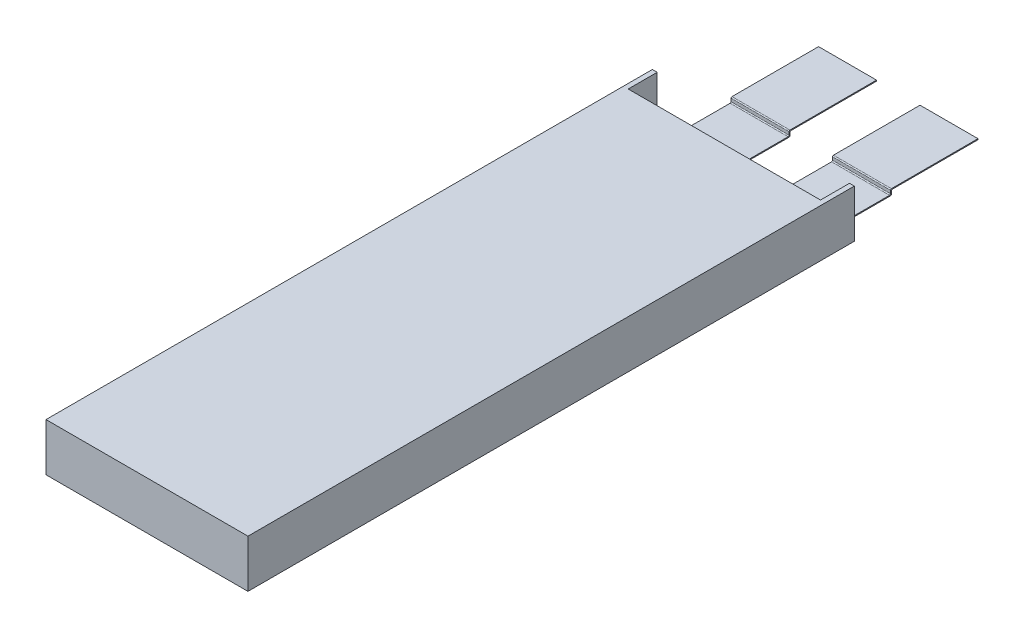
ISO-10303-21;
HEADER;
FILE_DESCRIPTION(('STEP AP214'),'2;1');
FILE_NAME('part.step','',(''),(''),'','','');
FILE_SCHEMA(('AUTOMOTIVE_DESIGN { 1 0 10303 214 1 1 1 1 }'));
ENDSEC;
DATA;
#1=APPLICATION_CONTEXT('core data for automotive mechanical design processes');
#2=APPLICATION_PROTOCOL_DEFINITION('international standard','automotive_design',2000,#1);
#3=PRODUCT_CONTEXT('',#1,'mechanical');
#4=PRODUCT('Part','Part','',(#3));
#5=PRODUCT_RELATED_PRODUCT_CATEGORY('part','',(#4));
#6=PRODUCT_DEFINITION_FORMATION('','',#4);
#7=PRODUCT_DEFINITION_CONTEXT('part definition',#1,'design');
#8=PRODUCT_DEFINITION('design','',#6,#7);
#9=PRODUCT_DEFINITION_SHAPE('','',#8);
#10=(LENGTH_UNIT() NAMED_UNIT(*) SI_UNIT(.MILLI.,.METRE.));
#11=(NAMED_UNIT(*) PLANE_ANGLE_UNIT() SI_UNIT($,.RADIAN.));
#12=(NAMED_UNIT(*) SI_UNIT($,.STERADIAN.) SOLID_ANGLE_UNIT());
#13=UNCERTAINTY_MEASURE_WITH_UNIT(LENGTH_MEASURE(1.E-05),#10,'distance_accuracy_value','');
#14=(GEOMETRIC_REPRESENTATION_CONTEXT(3) GLOBAL_UNCERTAINTY_ASSIGNED_CONTEXT((#13)) GLOBAL_UNIT_ASSIGNED_CONTEXT((#10,
#11,#12)) REPRESENTATION_CONTEXT('',''));
#15=CARTESIAN_POINT('',(0.,0.,0.));
#16=DIRECTION('',(0.,0.,1.));
#17=DIRECTION('',(1.,0.,0.));
#18=AXIS2_PLACEMENT_3D('',#15,#16,#17);
#19=CARTESIAN_POINT('',(0.,1.,0.));
#20=DIRECTION('',(0.,-1.,0.));
#21=DIRECTION('',(0.,0.,-1.));
#22=AXIS2_PLACEMENT_3D('',#19,#20,#21);
#23=PLANE('',#22);
#24=DIRECTION('',(-1.,0.,0.));
#25=VECTOR('',#24,1.);
#26=CARTESIAN_POINT('',(20.9,1.,-56.75));
#27=LINE('',#26,#25);
#28=CARTESIAN_POINT('',(19.9,1.,-56.75));
#29=VERTEX_POINT('',#28);
#30=CARTESIAN_POINT('',(-19.9,1.,-56.75));
#31=VERTEX_POINT('',#30);
#32=EDGE_CURVE('E542',#29,#31,#27,.T.);
#33=ORIENTED_EDGE('',*,*,#32,.F.);
#34=DIRECTION('',(0.,0.,-1.));
#35=VECTOR('',#34,1.);
#36=CARTESIAN_POINT('',(19.9,1.,-62.75));
#37=LINE('',#36,#35);
#38=CARTESIAN_POINT('',(19.9,1.,-62.75));
#39=VERTEX_POINT('',#38);
#40=EDGE_CURVE('E260',#29,#39,#37,.T.);
#41=ORIENTED_EDGE('',*,*,#40,.T.);
#42=DIRECTION('',(-1.,0.,0.));
#43=VECTOR('',#42,1.);
#44=CARTESIAN_POINT('',(20.9,1.,-62.75));
#45=LINE('',#44,#43);
#46=CARTESIAN_POINT('',(-19.9,1.,-62.75));
#47=VERTEX_POINT('',#46);
#48=EDGE_CURVE('E561',#39,#47,#45,.T.);
#49=ORIENTED_EDGE('',*,*,#48,.T.);
#50=DIRECTION('',(0.,0.,-1.));
#51=VECTOR('',#50,1.);
#52=CARTESIAN_POINT('',(-19.9,1.,-62.75));
#53=LINE('',#52,#51);
#54=EDGE_CURVE('E523',#31,#47,#53,.T.);
#55=ORIENTED_EDGE('',*,*,#54,.F.);
#56=EDGE_LOOP('',(#33,#41,#49,#55));
#57=FACE_BOUND('',#56,.T.);
#58=ADVANCED_FACE('F39',(#57),#23,.F.);
#59=CARTESIAN_POINT('',(20.9,9.9,-56.75));
#60=DIRECTION('',(0.,0.,1.));
#61=DIRECTION('',(1.,0.,0.));
#62=AXIS2_PLACEMENT_3D('',#59,#60,#61);
#63=PLANE('',#62);
#64=DIRECTION('',(-1.,0.,0.));
#65=VECTOR('',#64,1.);
#66=CARTESIAN_POINT('',(20.9,9.9,-56.75));
#67=LINE('',#66,#65);
#68=CARTESIAN_POINT('',(19.9,9.9,-56.75));
#69=VERTEX_POINT('',#68);
#70=CARTESIAN_POINT('',(-19.9,9.9,-56.75));
#71=VERTEX_POINT('',#70);
#72=EDGE_CURVE('E555',#69,#71,#67,.T.);
#73=ORIENTED_EDGE('',*,*,#72,.F.);
#74=DIRECTION('',(0.,-1.,0.));
#75=VECTOR('',#74,1.);
#76=CARTESIAN_POINT('',(19.9,9.9,-56.75));
#77=LINE('',#76,#75);
#78=EDGE_CURVE('E393',#69,#29,#77,.T.);
#79=ORIENTED_EDGE('',*,*,#78,.T.);
#80=ORIENTED_EDGE('',*,*,#32,.T.);
#81=DIRECTION('',(0.,-1.,0.));
#82=VECTOR('',#81,1.);
#83=CARTESIAN_POINT('',(-19.9,9.9,-56.75));
#84=LINE('',#83,#82);
#85=EDGE_CURVE('E538',#71,#31,#84,.T.);
#86=ORIENTED_EDGE('',*,*,#85,.F.);
#87=EDGE_LOOP('',(#73,#79,#80,#86));
#88=FACE_BOUND('',#87,.T.);
#89=ADVANCED_FACE('F652',(#88),#63,.F.);
#90=CARTESIAN_POINT('',(-20.9,1.,-62.75));
#91=DIRECTION('',(1.,0.,0.));
#92=DIRECTION('',(0.,0.,-1.));
#93=AXIS2_PLACEMENT_3D('',#90,#91,#92);
#94=PLANE('',#93);
#95=DIRECTION('',(0.,0.,1.));
#96=VECTOR('',#95,1.);
#97=CARTESIAN_POINT('',(-20.9,0.,-62.75));
#98=LINE('',#97,#96);
#99=CARTESIAN_POINT('',(-20.9,0.,-62.75));
#100=VERTEX_POINT('',#99);
#101=CARTESIAN_POINT('',(-20.9,0.,62.75));
#102=VERTEX_POINT('',#101);
#103=EDGE_CURVE('E558',#100,#102,#98,.T.);
#104=ORIENTED_EDGE('',*,*,#103,.T.);
#105=DIRECTION('',(0.,-1.,0.));
#106=VECTOR('',#105,1.);
#107=CARTESIAN_POINT('',(-20.9,1.,62.75));
#108=LINE('',#107,#106);
#109=CARTESIAN_POINT('',(-20.9,9.9,62.75));
#110=VERTEX_POINT('',#109);
#111=EDGE_CURVE('E11',#110,#102,#108,.T.);
#112=ORIENTED_EDGE('',*,*,#111,.F.);
#113=DIRECTION('',(0.,0.,1.));
#114=VECTOR('',#113,1.);
#115=CARTESIAN_POINT('',(-20.9,9.9,-56.75));
#116=LINE('',#115,#114);
#117=CARTESIAN_POINT('',(-20.9,9.9,-62.75));
#118=VERTEX_POINT('',#117);
#119=EDGE_CURVE('E543',#118,#110,#116,.T.);
#120=ORIENTED_EDGE('',*,*,#119,.F.);
#121=DIRECTION('',(0.,-1.,0.));
#122=VECTOR('',#121,1.);
#123=CARTESIAN_POINT('',(-20.9,1.,-62.75));
#124=LINE('',#123,#122);
#125=EDGE_CURVE('E564',#118,#100,#124,.T.);
#126=ORIENTED_EDGE('',*,*,#125,.T.);
#127=EDGE_LOOP('',(#104,#112,#120,#126));
#128=FACE_BOUND('',#127,.T.);
#129=ADVANCED_FACE('F41',(#128),#94,.F.);
#130=CARTESIAN_POINT('',(20.9,1.,62.75));
#131=DIRECTION('',(0.,0.,-1.));
#132=DIRECTION('',(-1.,0.,0.));
#133=AXIS2_PLACEMENT_3D('',#130,#131,#132);
#134=PLANE('',#133);
#135=DIRECTION('',(1.,0.,0.));
#136=VECTOR('',#135,1.);
#137=CARTESIAN_POINT('',(20.9,0.,62.75));
#138=LINE('',#137,#136);
#139=CARTESIAN_POINT('',(20.9,0.,62.75));
#140=VERTEX_POINT('',#139);
#141=EDGE_CURVE('E569',#102,#140,#138,.T.);
#142=ORIENTED_EDGE('',*,*,#141,.T.);
#143=DIRECTION('',(0.,-1.,0.));
#144=VECTOR('',#143,1.);
#145=CARTESIAN_POINT('',(20.9,1.,62.75));
#146=LINE('',#145,#144);
#147=CARTESIAN_POINT('',(20.9,9.9,62.75));
#148=VERTEX_POINT('',#147);
#149=EDGE_CURVE('E48',#148,#140,#146,.T.);
#150=ORIENTED_EDGE('',*,*,#149,.F.);
#151=DIRECTION('',(1.,0.,0.));
#152=VECTOR('',#151,1.);
#153=CARTESIAN_POINT('',(20.9,9.9,62.75));
#154=LINE('',#153,#152);
#155=EDGE_CURVE('E547',#110,#148,#154,.T.);
#156=ORIENTED_EDGE('',*,*,#155,.F.);
#157=ORIENTED_EDGE('',*,*,#111,.T.);
#158=EDGE_LOOP('',(#142,#150,#156,#157));
#159=FACE_BOUND('',#158,.T.);
#160=ADVANCED_FACE('F606',(#159),#134,.F.);
#161=CARTESIAN_POINT('',(20.9,1.,-62.75));
#162=DIRECTION('',(-1.,0.,0.));
#163=DIRECTION('',(0.,0.,1.));
#164=AXIS2_PLACEMENT_3D('',#161,#162,#163);
#165=PLANE('',#164);
#166=DIRECTION('',(0.,0.,-1.));
#167=VECTOR('',#166,1.);
#168=CARTESIAN_POINT('',(20.9,0.,-62.75));
#169=LINE('',#168,#167);
#170=CARTESIAN_POINT('',(20.9,0.,-62.75));
#171=VERTEX_POINT('',#170);
#172=EDGE_CURVE('E572',#140,#171,#169,.T.);
#173=ORIENTED_EDGE('',*,*,#172,.T.);
#174=DIRECTION('',(0.,-1.,0.));
#175=VECTOR('',#174,1.);
#176=CARTESIAN_POINT('',(20.9,1.,-62.75));
#177=LINE('',#176,#175);
#178=CARTESIAN_POINT('',(20.9,9.9,-62.75));
#179=VERTEX_POINT('',#178);
#180=EDGE_CURVE('E583',#179,#171,#177,.T.);
#181=ORIENTED_EDGE('',*,*,#180,.F.);
#182=DIRECTION('',(0.,0.,-1.));
#183=VECTOR('',#182,1.);
#184=CARTESIAN_POINT('',(20.9,9.9,-56.75));
#185=LINE('',#184,#183);
#186=EDGE_CURVE('E551',#148,#179,#185,.T.);
#187=ORIENTED_EDGE('',*,*,#186,.F.);
#188=ORIENTED_EDGE('',*,*,#149,.T.);
#189=EDGE_LOOP('',(#173,#181,#187,#188));
#190=FACE_BOUND('',#189,.T.);
#191=ADVANCED_FACE('F591',(#190),#165,.F.);
#192=CARTESIAN_POINT('',(20.9,1.,-62.75));
#193=DIRECTION('',(0.,0.,1.));
#194=DIRECTION('',(1.,0.,0.));
#195=AXIS2_PLACEMENT_3D('',#192,#193,#194);
#196=PLANE('',#195);
#197=DIRECTION('',(1.,0.,0.));
#198=VECTOR('',#197,1.);
#199=CARTESIAN_POINT('',(-16.5,0.2,-62.75));
#200=LINE('',#199,#198);
#201=CARTESIAN_POINT('',(-16.5,0.2,-62.75));
#202=VERTEX_POINT('',#201);
#203=CARTESIAN_POINT('',(-4.5,0.199999999999999,-62.75));
#204=VERTEX_POINT('',#203);
#205=EDGE_CURVE('E55',#202,#204,#200,.T.);
#206=ORIENTED_EDGE('',*,*,#205,.F.);
#207=DIRECTION('',(0.,-1.,0.));
#208=VECTOR('',#207,1.);
#209=CARTESIAN_POINT('',(-16.5,0.,-62.75));
#210=LINE('',#209,#208);
#211=CARTESIAN_POINT('',(-16.5,0.,-62.75));
#212=VERTEX_POINT('',#211);
#213=EDGE_CURVE('E294',#202,#212,#210,.T.);
#214=ORIENTED_EDGE('',*,*,#213,.T.);
#215=DIRECTION('',(-1.,0.,0.));
#216=VECTOR('',#215,1.);
#217=CARTESIAN_POINT('',(20.9,0.,-62.75));
#218=LINE('',#217,#216);
#219=EDGE_CURVE('E575',#212,#100,#218,.T.);
#220=ORIENTED_EDGE('',*,*,#219,.T.);
#221=ORIENTED_EDGE('',*,*,#125,.F.);
#222=DIRECTION('',(-1.,0.,0.));
#223=VECTOR('',#222,1.);
#224=CARTESIAN_POINT('',(-20.9,9.9,-62.75));
#225=LINE('',#224,#223);
#226=CARTESIAN_POINT('',(-19.9,9.9,-62.75));
#227=VERTEX_POINT('',#226);
#228=EDGE_CURVE('E527',#227,#118,#225,.T.);
#229=ORIENTED_EDGE('',*,*,#228,.F.);
#230=DIRECTION('',(0.,-1.,0.));
#231=VECTOR('',#230,1.);
#232=CARTESIAN_POINT('',(-19.9,9.9,-62.75));
#233=LINE('',#232,#231);
#234=EDGE_CURVE('E531',#227,#47,#233,.T.);
#235=ORIENTED_EDGE('',*,*,#234,.T.);
#236=ORIENTED_EDGE('',*,*,#48,.F.);
#237=DIRECTION('',(0.,-1.,0.));
#238=VECTOR('',#237,1.);
#239=CARTESIAN_POINT('',(19.9,9.9,-62.75));
#240=LINE('',#239,#238);
#241=CARTESIAN_POINT('',(19.9,9.9,-62.75));
#242=VERTEX_POINT('',#241);
#243=EDGE_CURVE('E400',#242,#39,#240,.T.);
#244=ORIENTED_EDGE('',*,*,#243,.F.);
#245=DIRECTION('',(1.,0.,0.));
#246=VECTOR('',#245,1.);
#247=CARTESIAN_POINT('',(20.9,9.9,-62.75));
#248=LINE('',#247,#246);
#249=EDGE_CURVE('E385',#242,#179,#248,.T.);
#250=ORIENTED_EDGE('',*,*,#249,.T.);
#251=ORIENTED_EDGE('',*,*,#180,.T.);
#252=CARTESIAN_POINT('',(16.5,0.,-62.75));
#253=VERTEX_POINT('',#252);
#254=EDGE_CURVE('E565',#171,#253,#218,.T.);
#255=ORIENTED_EDGE('',*,*,#254,.T.);
#256=DIRECTION('',(0.,-1.,0.));
#257=VECTOR('',#256,1.);
#258=CARTESIAN_POINT('',(16.5,0.,-62.75));
#259=LINE('',#258,#257);
#260=CARTESIAN_POINT('',(16.5,0.2,-62.75));
#261=VERTEX_POINT('',#260);
#262=EDGE_CURVE('E424',#261,#253,#259,.T.);
#263=ORIENTED_EDGE('',*,*,#262,.F.);
#264=DIRECTION('',(-1.,0.,0.));
#265=VECTOR('',#264,1.);
#266=CARTESIAN_POINT('',(16.5,0.2,-62.75));
#267=LINE('',#266,#265);
#268=CARTESIAN_POINT('',(4.5,0.2,-62.75));
#269=VERTEX_POINT('',#268);
#270=EDGE_CURVE('E499',#261,#269,#267,.T.);
#271=ORIENTED_EDGE('',*,*,#270,.T.);
#272=DIRECTION('',(0.,-1.,0.));
#273=VECTOR('',#272,1.);
#274=CARTESIAN_POINT('',(4.5,0.,-62.75));
#275=LINE('',#274,#273);
#276=CARTESIAN_POINT('',(4.5,0.,-62.75));
#277=VERTEX_POINT('',#276);
#278=EDGE_CURVE('E462',#269,#277,#275,.T.);
#279=ORIENTED_EDGE('',*,*,#278,.T.);
#280=CARTESIAN_POINT('',(-4.5,0.,-62.75));
#281=VERTEX_POINT('',#280);
#282=EDGE_CURVE('E579',#277,#281,#218,.T.);
#283=ORIENTED_EDGE('',*,*,#282,.T.);
#284=DIRECTION('',(0.,-1.,0.));
#285=VECTOR('',#284,1.);
#286=CARTESIAN_POINT('',(-4.5,0.,-62.75));
#287=LINE('',#286,#285);
#288=EDGE_CURVE('E60',#204,#281,#287,.T.);
#289=ORIENTED_EDGE('',*,*,#288,.F.);
#290=EDGE_LOOP('',(#206,#214,#220,#221,#229,#235,#236,#244,#250,#251,#255,#263,#271,#279,#283,#289));
#291=FACE_BOUND('',#290,.T.);
#292=ADVANCED_FACE('F601',(#291),#196,.F.);
#293=CARTESIAN_POINT('',(0.,0.,0.));
#294=DIRECTION('',(0.,-1.,0.));
#295=DIRECTION('',(0.,0.,-1.));
#296=AXIS2_PLACEMENT_3D('',#293,#294,#295);
#297=PLANE('',#296);
#298=ORIENTED_EDGE('',*,*,#103,.F.);
#299=ORIENTED_EDGE('',*,*,#219,.F.);
#300=DIRECTION('',(0.,0.,-1.));
#301=VECTOR('',#300,1.);
#302=CARTESIAN_POINT('',(-16.5,0.,-62.75));
#303=LINE('',#302,#301);
#304=CARTESIAN_POINT('',(-16.5,0.,-74.6375719936611));
#305=VERTEX_POINT('',#304);
#306=EDGE_CURVE('E290',#212,#305,#303,.T.);
#307=ORIENTED_EDGE('',*,*,#306,.T.);
#308=DIRECTION('',(1.,0.,0.));
#309=VECTOR('',#308,1.);
#310=CARTESIAN_POINT('',(-16.5,0.,-74.6375719936611));
#311=LINE('',#310,#309);
#312=CARTESIAN_POINT('',(-4.5,0.,-74.6375719936611));
#313=VERTEX_POINT('',#312);
#314=EDGE_CURVE('E374',#305,#313,#311,.T.);
#315=ORIENTED_EDGE('',*,*,#314,.T.);
#316=DIRECTION('',(0.,0.,-1.));
#317=VECTOR('',#316,1.);
#318=CARTESIAN_POINT('',(-4.5,0.,-62.75));
#319=LINE('',#318,#317);
#320=EDGE_CURVE('E333',#281,#313,#319,.T.);
#321=ORIENTED_EDGE('',*,*,#320,.F.);
#322=ORIENTED_EDGE('',*,*,#282,.F.);
#323=DIRECTION('',(0.,0.,-1.));
#324=VECTOR('',#323,1.);
#325=CARTESIAN_POINT('',(4.5,0.,-62.75));
#326=LINE('',#325,#324);
#327=CARTESIAN_POINT('',(4.5,0.,-74.6375719936611));
#328=VERTEX_POINT('',#327);
#329=EDGE_CURVE('E466',#277,#328,#326,.T.);
#330=ORIENTED_EDGE('',*,*,#329,.T.);
#331=DIRECTION('',(-1.,0.,0.));
#332=VECTOR('',#331,1.);
#333=CARTESIAN_POINT('',(16.5,0.,-74.6375719936611));
#334=LINE('',#333,#332);
#335=CARTESIAN_POINT('',(16.5,0.,-74.6375719936611));
#336=VERTEX_POINT('',#335);
#337=EDGE_CURVE('E495',#336,#328,#334,.T.);
#338=ORIENTED_EDGE('',*,*,#337,.F.);
#339=DIRECTION('',(0.,0.,-1.));
#340=VECTOR('',#339,1.);
#341=CARTESIAN_POINT('',(16.5,0.,-62.75));
#342=LINE('',#341,#340);
#343=EDGE_CURVE('E427',#253,#336,#342,.T.);
#344=ORIENTED_EDGE('',*,*,#343,.F.);
#345=ORIENTED_EDGE('',*,*,#254,.F.);
#346=ORIENTED_EDGE('',*,*,#172,.F.);
#347=ORIENTED_EDGE('',*,*,#141,.F.);
#348=EDGE_LOOP('',(#298,#299,#307,#315,#321,#322,#330,#338,#344,#345,#346,#347));
#349=FACE_BOUND('',#348,.T.);
#350=ADVANCED_FACE('F597',(#349),#297,.T.);
#351=CARTESIAN_POINT('',(0.,9.9,0.));
#352=DIRECTION('',(0.,-1.,0.));
#353=DIRECTION('',(0.,0.,-1.));
#354=AXIS2_PLACEMENT_3D('',#351,#352,#353);
#355=PLANE('',#354);
#356=ORIENTED_EDGE('',*,*,#119,.T.);
#357=ORIENTED_EDGE('',*,*,#155,.T.);
#358=ORIENTED_EDGE('',*,*,#186,.T.);
#359=ORIENTED_EDGE('',*,*,#249,.F.);
#360=DIRECTION('',(0.,0.,-1.));
#361=VECTOR('',#360,1.);
#362=CARTESIAN_POINT('',(19.9,9.9,-62.75));
#363=LINE('',#362,#361);
#364=EDGE_CURVE('E389',#69,#242,#363,.T.);
#365=ORIENTED_EDGE('',*,*,#364,.F.);
#366=ORIENTED_EDGE('',*,*,#72,.T.);
#367=DIRECTION('',(0.,0.,-1.));
#368=VECTOR('',#367,1.);
#369=CARTESIAN_POINT('',(-19.9,9.9,-62.75));
#370=LINE('',#369,#368);
#371=EDGE_CURVE('E524',#71,#227,#370,.T.);
#372=ORIENTED_EDGE('',*,*,#371,.T.);
#373=ORIENTED_EDGE('',*,*,#228,.T.);
#374=EDGE_LOOP('',(#356,#357,#358,#359,#365,#366,#372,#373));
#375=FACE_BOUND('',#374,.T.);
#376=ADVANCED_FACE('F604',(#375),#355,.F.);
#377=CARTESIAN_POINT('',(-19.9,9.9,-62.75));
#378=DIRECTION('',(-1.,0.,0.));
#379=DIRECTION('',(0.,0.,1.));
#380=AXIS2_PLACEMENT_3D('',#377,#378,#379);
#381=PLANE('',#380);
#382=ORIENTED_EDGE('',*,*,#54,.T.);
#383=ORIENTED_EDGE('',*,*,#234,.F.);
#384=ORIENTED_EDGE('',*,*,#371,.F.);
#385=ORIENTED_EDGE('',*,*,#85,.T.);
#386=EDGE_LOOP('',(#382,#383,#384,#385));
#387=FACE_BOUND('',#386,.T.);
#388=ADVANCED_FACE('F716',(#387),#381,.F.);
#389=CARTESIAN_POINT('',(16.5,1.2,-92.75));
#390=DIRECTION('',(0.,0.,1.));
#391=DIRECTION('',(1.,0.,0.));
#392=AXIS2_PLACEMENT_3D('',#389,#390,#391);
#393=PLANE('',#392);
#394=DIRECTION('',(0.,1.,0.));
#395=VECTOR('',#394,1.);
#396=CARTESIAN_POINT('',(4.5,1.2,-92.75));
#397=LINE('',#396,#395);
#398=CARTESIAN_POINT('',(4.5,1.,-92.75));
#399=VERTEX_POINT('',#398);
#400=CARTESIAN_POINT('',(4.5,1.2,-92.75));
#401=VERTEX_POINT('',#400);
#402=EDGE_CURVE('E403',#399,#401,#397,.T.);
#403=ORIENTED_EDGE('',*,*,#402,.T.);
#404=DIRECTION('',(-1.,0.,0.));
#405=VECTOR('',#404,1.);
#406=CARTESIAN_POINT('',(16.5,1.2,-92.75));
#407=LINE('',#406,#405);
#408=CARTESIAN_POINT('',(16.5,1.2,-92.75));
#409=VERTEX_POINT('',#408);
#410=EDGE_CURVE('E519',#409,#401,#407,.T.);
#411=ORIENTED_EDGE('',*,*,#410,.F.);
#412=DIRECTION('',(0.,1.,0.));
#413=VECTOR('',#412,1.);
#414=CARTESIAN_POINT('',(16.5,1.2,-92.75));
#415=LINE('',#414,#413);
#416=CARTESIAN_POINT('',(16.5,1.,-92.75));
#417=VERTEX_POINT('',#416);
#418=EDGE_CURVE('E404',#417,#409,#415,.T.);
#419=ORIENTED_EDGE('',*,*,#418,.F.);
#420=DIRECTION('',(-1.,0.,0.));
#421=VECTOR('',#420,1.);
#422=CARTESIAN_POINT('',(16.5,1.,-92.75));
#423=LINE('',#422,#421);
#424=EDGE_CURVE('E442',#417,#399,#423,.T.);
#425=ORIENTED_EDGE('',*,*,#424,.T.);
#426=EDGE_LOOP('',(#403,#411,#419,#425));
#427=FACE_BOUND('',#426,.T.);
#428=ADVANCED_FACE('F861',(#427),#393,.F.);
#429=CARTESIAN_POINT('',(16.5,1.2,-74.8375719936611));
#430=DIRECTION('',(0.,-1.,0.));
#431=DIRECTION('',(0.,0.,-1.));
#432=AXIS2_PLACEMENT_3D('',#429,#430,#431);
#433=PLANE('',#432);
#434=DIRECTION('',(0.,0.,1.));
#435=VECTOR('',#434,1.);
#436=CARTESIAN_POINT('',(4.5,1.2,-74.8375719936611));
#437=LINE('',#436,#435);
#438=CARTESIAN_POINT('',(4.5,1.2,-74.8375719936611));
#439=VERTEX_POINT('',#438);
#440=EDGE_CURVE('E446',#401,#439,#437,.T.);
#441=ORIENTED_EDGE('',*,*,#440,.T.);
#442=DIRECTION('',(-1.,0.,0.));
#443=VECTOR('',#442,1.);
#444=CARTESIAN_POINT('',(16.5,1.2,-74.8375719936611));
#445=LINE('',#444,#443);
#446=CARTESIAN_POINT('',(16.5,1.2,-74.8375719936611));
#447=VERTEX_POINT('',#446);
#448=EDGE_CURVE('E515',#447,#439,#445,.T.);
#449=ORIENTED_EDGE('',*,*,#448,.F.);
#450=DIRECTION('',(0.,0.,1.));
#451=VECTOR('',#450,1.);
#452=CARTESIAN_POINT('',(16.5,1.2,-74.8375719936611));
#453=LINE('',#452,#451);
#454=EDGE_CURVE('E408',#409,#447,#453,.T.);
#455=ORIENTED_EDGE('',*,*,#454,.F.);
#456=ORIENTED_EDGE('',*,*,#410,.T.);
#457=EDGE_LOOP('',(#441,#449,#455,#456));
#458=FACE_BOUND('',#457,.T.);
#459=ADVANCED_FACE('F857',(#458),#433,.F.);
#460=CARTESIAN_POINT('',(16.5,1.,-74.8375719936611));
#461=DIRECTION('',(-1.,0.,0.));
#462=DIRECTION('',(0.,0.,1.));
#463=AXIS2_PLACEMENT_3D('',#460,#461,#462);
#464=CYLINDRICAL_SURFACE('',#463,0.200000000000003);
#465=CARTESIAN_POINT('',(4.5,1.,-74.8375719936611));
#466=DIRECTION('',(1.,0.,0.));
#467=DIRECTION('',(0.,0.,-1.));
#468=AXIS2_PLACEMENT_3D('',#465,#466,#467);
#469=CIRCLE('',#468,0.200000000000003);
#470=CARTESIAN_POINT('',(4.5,0.999999999999999,-74.6375719936611));
#471=VERTEX_POINT('',#470);
#472=EDGE_CURVE('E449',#439,#471,#469,.T.);
#473=ORIENTED_EDGE('',*,*,#472,.T.);
#474=DIRECTION('',(-1.,0.,0.));
#475=VECTOR('',#474,1.);
#476=CARTESIAN_POINT('',(16.5,0.999999999999999,-74.6375719936611));
#477=LINE('',#476,#475);
#478=CARTESIAN_POINT('',(16.5,0.999999999999999,-74.6375719936611));
#479=VERTEX_POINT('',#478);
#480=EDGE_CURVE('E511',#479,#471,#477,.T.);
#481=ORIENTED_EDGE('',*,*,#480,.F.);
#482=CARTESIAN_POINT('',(16.5,1.,-74.8375719936611));
#483=DIRECTION('',(1.,0.,0.));
#484=DIRECTION('',(0.,0.,-1.));
#485=AXIS2_PLACEMENT_3D('',#482,#483,#484);
#486=CIRCLE('',#485,0.200000000000003);
#487=EDGE_CURVE('E412',#447,#479,#486,.T.);
#488=ORIENTED_EDGE('',*,*,#487,.F.);
#489=ORIENTED_EDGE('',*,*,#448,.T.);
#490=EDGE_LOOP('',(#473,#481,#488,#489));
#491=FACE_BOUND('',#490,.T.);
#492=ADVANCED_FACE('F853',(#491),#464,.T.);
#493=CARTESIAN_POINT('',(16.5,0.999999999999999,-74.6375719936611));
#494=DIRECTION('',(0.,0.,-1.));
#495=DIRECTION('',(-1.,0.,0.));
#496=AXIS2_PLACEMENT_3D('',#493,#494,#495);
#497=PLANE('',#496);
#498=DIRECTION('',(0.,-1.,0.));
#499=VECTOR('',#498,1.);
#500=CARTESIAN_POINT('',(4.5,0.999999999999999,-74.6375719936611));
#501=LINE('',#500,#499);
#502=CARTESIAN_POINT('',(4.5,0.400000000000001,-74.6375719936611));
#503=VERTEX_POINT('',#502);
#504=EDGE_CURVE('E452',#471,#503,#501,.T.);
#505=ORIENTED_EDGE('',*,*,#504,.T.);
#506=DIRECTION('',(-1.,0.,0.));
#507=VECTOR('',#506,1.);
#508=CARTESIAN_POINT('',(16.5,0.400000000000001,-74.6375719936611));
#509=LINE('',#508,#507);
#510=CARTESIAN_POINT('',(16.5,0.400000000000001,-74.6375719936611));
#511=VERTEX_POINT('',#510);
#512=EDGE_CURVE('E507',#511,#503,#509,.T.);
#513=ORIENTED_EDGE('',*,*,#512,.F.);
#514=DIRECTION('',(0.,-1.,0.));
#515=VECTOR('',#514,1.);
#516=CARTESIAN_POINT('',(16.5,0.999999999999999,-74.6375719936611));
#517=LINE('',#516,#515);
#518=EDGE_CURVE('E415',#479,#511,#517,.T.);
#519=ORIENTED_EDGE('',*,*,#518,.F.);
#520=ORIENTED_EDGE('',*,*,#480,.T.);
#521=EDGE_LOOP('',(#505,#513,#519,#520));
#522=FACE_BOUND('',#521,.T.);
#523=ADVANCED_FACE('F849',(#522),#497,.F.);
#524=CARTESIAN_POINT('',(16.5,0.4,-74.4375719936611));
#525=DIRECTION('',(-1.,0.,0.));
#526=DIRECTION('',(0.,0.,1.));
#527=AXIS2_PLACEMENT_3D('',#524,#525,#526);
#528=CYLINDRICAL_SURFACE('',#527,0.200000000000003);
#529=CARTESIAN_POINT('',(4.5,0.4,-74.4375719936611));
#530=DIRECTION('',(-1.,0.,0.));
#531=DIRECTION('',(0.,0.,-1.));
#532=AXIS2_PLACEMENT_3D('',#529,#530,#531);
#533=CIRCLE('',#532,0.200000000000003);
#534=CARTESIAN_POINT('',(4.5,0.199999999999997,-74.4375719936611));
#535=VERTEX_POINT('',#534);
#536=EDGE_CURVE('E455',#503,#535,#533,.T.);
#537=ORIENTED_EDGE('',*,*,#536,.T.);
#538=DIRECTION('',(-1.,0.,0.));
#539=VECTOR('',#538,1.);
#540=CARTESIAN_POINT('',(16.5,0.199999999999997,-74.4375719936611));
#541=LINE('',#540,#539);
#542=CARTESIAN_POINT('',(16.5,0.199999999999997,-74.4375719936611));
#543=VERTEX_POINT('',#542);
#544=EDGE_CURVE('E503',#543,#535,#541,.T.);
#545=ORIENTED_EDGE('',*,*,#544,.F.);
#546=CARTESIAN_POINT('',(16.5,0.4,-74.4375719936611));
#547=DIRECTION('',(-1.,0.,0.));
#548=DIRECTION('',(0.,0.,-1.));
#549=AXIS2_PLACEMENT_3D('',#546,#547,#548);
#550=CIRCLE('',#549,0.200000000000003);
#551=EDGE_CURVE('E418',#511,#543,#550,.T.);
#552=ORIENTED_EDGE('',*,*,#551,.F.);
#553=ORIENTED_EDGE('',*,*,#512,.T.);
#554=EDGE_LOOP('',(#537,#545,#552,#553));
#555=FACE_BOUND('',#554,.T.);
#556=ADVANCED_FACE('F845',(#555),#528,.F.);
#557=CARTESIAN_POINT('',(16.5,0.2,-62.75));
#558=DIRECTION('',(0.,-1.,0.));
#559=DIRECTION('',(0.,0.,-1.));
#560=AXIS2_PLACEMENT_3D('',#557,#558,#559);
#561=PLANE('',#560);
#562=DIRECTION('',(0.,0.,1.));
#563=VECTOR('',#562,1.);
#564=CARTESIAN_POINT('',(4.5,0.2,-62.75));
#565=LINE('',#564,#563);
#566=EDGE_CURVE('E458',#535,#269,#565,.T.);
#567=ORIENTED_EDGE('',*,*,#566,.T.);
#568=ORIENTED_EDGE('',*,*,#270,.F.);
#569=DIRECTION('',(0.,0.,1.));
#570=VECTOR('',#569,1.);
#571=CARTESIAN_POINT('',(16.5,0.2,-62.75));
#572=LINE('',#571,#570);
#573=EDGE_CURVE('E421',#543,#261,#572,.T.);
#574=ORIENTED_EDGE('',*,*,#573,.F.);
#575=ORIENTED_EDGE('',*,*,#544,.T.);
#576=EDGE_LOOP('',(#567,#568,#574,#575));
#577=FACE_BOUND('',#576,.T.);
#578=ADVANCED_FACE('F841',(#577),#561,.F.);
#579=CARTESIAN_POINT('',(16.5,0.2,-74.6375719936611));
#580=DIRECTION('',(-1.,0.,0.));
#581=DIRECTION('',(0.,0.,1.));
#582=AXIS2_PLACEMENT_3D('',#579,#580,#581);
#583=CYLINDRICAL_SURFACE('',#582,0.200000000000003);
#584=CARTESIAN_POINT('',(4.5,0.2,-74.6375719936611));
#585=DIRECTION('',(1.,0.,0.));
#586=DIRECTION('',(0.,0.,-1.));
#587=AXIS2_PLACEMENT_3D('',#584,#585,#586);
#588=CIRCLE('',#587,0.200000000000003);
#589=CARTESIAN_POINT('',(4.5,0.2,-74.8375719936611));
#590=VERTEX_POINT('',#589);
#591=EDGE_CURVE('E469',#328,#590,#588,.T.);
#592=ORIENTED_EDGE('',*,*,#591,.T.);
#593=DIRECTION('',(-1.,0.,0.));
#594=VECTOR('',#593,1.);
#595=CARTESIAN_POINT('',(16.5,0.2,-74.8375719936611));
#596=LINE('',#595,#594);
#597=CARTESIAN_POINT('',(16.5,0.2,-74.8375719936611));
#598=VERTEX_POINT('',#597);
#599=EDGE_CURVE('E491',#598,#590,#596,.T.);
#600=ORIENTED_EDGE('',*,*,#599,.F.);
#601=CARTESIAN_POINT('',(16.5,0.2,-74.6375719936611));
#602=DIRECTION('',(1.,0.,0.));
#603=DIRECTION('',(0.,0.,-1.));
#604=AXIS2_PLACEMENT_3D('',#601,#602,#603);
#605=CIRCLE('',#604,0.200000000000003);
#606=EDGE_CURVE('E430',#336,#598,#605,.T.);
#607=ORIENTED_EDGE('',*,*,#606,.F.);
#608=ORIENTED_EDGE('',*,*,#337,.T.);
#609=EDGE_LOOP('',(#592,#600,#607,#608));
#610=FACE_BOUND('',#609,.T.);
#611=ADVANCED_FACE('F837',(#610),#583,.T.);
#612=CARTESIAN_POINT('',(16.5,0.799999999999996,-74.8375719936611));
#613=DIRECTION('',(0.,0.,1.));
#614=DIRECTION('',(1.,0.,0.));
#615=AXIS2_PLACEMENT_3D('',#612,#613,#614);
#616=PLANE('',#615);
#617=DIRECTION('',(0.,1.,0.));
#618=VECTOR('',#617,1.);
#619=CARTESIAN_POINT('',(4.5,0.799999999999996,-74.8375719936611));
#620=LINE('',#619,#618);
#621=CARTESIAN_POINT('',(4.5,0.799999999999996,-74.8375719936611));
#622=VERTEX_POINT('',#621);
#623=EDGE_CURVE('E472',#590,#622,#620,.T.);
#624=ORIENTED_EDGE('',*,*,#623,.T.);
#625=DIRECTION('',(-1.,0.,0.));
#626=VECTOR('',#625,1.);
#627=CARTESIAN_POINT('',(16.5,0.799999999999996,-74.8375719936611));
#628=LINE('',#627,#626);
#629=CARTESIAN_POINT('',(16.5,0.799999999999996,-74.8375719936611));
#630=VERTEX_POINT('',#629);
#631=EDGE_CURVE('E487',#630,#622,#628,.T.);
#632=ORIENTED_EDGE('',*,*,#631,.F.);
#633=DIRECTION('',(0.,1.,0.));
#634=VECTOR('',#633,1.);
#635=CARTESIAN_POINT('',(16.5,0.799999999999996,-74.8375719936611));
#636=LINE('',#635,#634);
#637=EDGE_CURVE('E433',#598,#630,#636,.T.);
#638=ORIENTED_EDGE('',*,*,#637,.F.);
#639=ORIENTED_EDGE('',*,*,#599,.T.);
#640=EDGE_LOOP('',(#624,#632,#638,#639));
#641=FACE_BOUND('',#640,.T.);
#642=ADVANCED_FACE('F833',(#641),#616,.F.);
#643=CARTESIAN_POINT('',(16.5,0.799999999999998,-75.0375719936611));
#644=DIRECTION('',(-1.,0.,0.));
#645=DIRECTION('',(0.,0.,1.));
#646=AXIS2_PLACEMENT_3D('',#643,#644,#645);
#647=CYLINDRICAL_SURFACE('',#646,0.200000000000003);
#648=CARTESIAN_POINT('',(4.5,0.799999999999998,-75.0375719936611));
#649=DIRECTION('',(-1.,0.,0.));
#650=DIRECTION('',(0.,0.,-1.));
#651=AXIS2_PLACEMENT_3D('',#648,#649,#650);
#652=CIRCLE('',#651,0.200000000000003);
#653=CARTESIAN_POINT('',(4.5,1.,-75.0375719936611));
#654=VERTEX_POINT('',#653);
#655=EDGE_CURVE('E475',#622,#654,#652,.T.);
#656=ORIENTED_EDGE('',*,*,#655,.T.);
#657=DIRECTION('',(-1.,0.,0.));
#658=VECTOR('',#657,1.);
#659=CARTESIAN_POINT('',(16.5,1.,-75.0375719936611));
#660=LINE('',#659,#658);
#661=CARTESIAN_POINT('',(16.5,1.,-75.0375719936611));
#662=VERTEX_POINT('',#661);
#663=EDGE_CURVE('E483',#662,#654,#660,.T.);
#664=ORIENTED_EDGE('',*,*,#663,.F.);
#665=CARTESIAN_POINT('',(16.5,0.799999999999998,-75.0375719936611));
#666=DIRECTION('',(-1.,0.,0.));
#667=DIRECTION('',(0.,0.,-1.));
#668=AXIS2_PLACEMENT_3D('',#665,#666,#667);
#669=CIRCLE('',#668,0.200000000000003);
#670=EDGE_CURVE('E436',#630,#662,#669,.T.);
#671=ORIENTED_EDGE('',*,*,#670,.F.);
#672=ORIENTED_EDGE('',*,*,#631,.T.);
#673=EDGE_LOOP('',(#656,#664,#671,#672));
#674=FACE_BOUND('',#673,.T.);
#675=ADVANCED_FACE('F829',(#674),#647,.F.);
#676=CARTESIAN_POINT('',(16.5,1.,-92.75));
#677=DIRECTION('',(0.,1.,0.));
#678=DIRECTION('',(0.,0.,1.));
#679=AXIS2_PLACEMENT_3D('',#676,#677,#678);
#680=PLANE('',#679);
#681=DIRECTION('',(0.,0.,-1.));
#682=VECTOR('',#681,1.);
#683=CARTESIAN_POINT('',(4.5,1.,-92.75));
#684=LINE('',#683,#682);
#685=EDGE_CURVE('E409',#654,#399,#684,.T.);
#686=ORIENTED_EDGE('',*,*,#685,.T.);
#687=ORIENTED_EDGE('',*,*,#424,.F.);
#688=DIRECTION('',(0.,0.,-1.));
#689=VECTOR('',#688,1.);
#690=CARTESIAN_POINT('',(16.5,1.,-92.75));
#691=LINE('',#690,#689);
#692=EDGE_CURVE('E439',#662,#417,#691,.T.);
#693=ORIENTED_EDGE('',*,*,#692,.F.);
#694=ORIENTED_EDGE('',*,*,#663,.T.);
#695=EDGE_LOOP('',(#686,#687,#693,#694));
#696=FACE_BOUND('',#695,.T.);
#697=ADVANCED_FACE('F823',(#696),#680,.F.);
#698=CARTESIAN_POINT('',(16.5,0.799999999999998,-75.0375719936611));
#699=DIRECTION('',(1.,0.,0.));
#700=DIRECTION('',(0.,0.,-1.));
#701=AXIS2_PLACEMENT_3D('',#698,#699,#700);
#702=PLANE('',#701);
#703=ORIENTED_EDGE('',*,*,#418,.T.);
#704=ORIENTED_EDGE('',*,*,#454,.T.);
#705=ORIENTED_EDGE('',*,*,#487,.T.);
#706=ORIENTED_EDGE('',*,*,#518,.T.);
#707=ORIENTED_EDGE('',*,*,#551,.T.);
#708=ORIENTED_EDGE('',*,*,#573,.T.);
#709=ORIENTED_EDGE('',*,*,#262,.T.);
#710=ORIENTED_EDGE('',*,*,#343,.T.);
#711=ORIENTED_EDGE('',*,*,#606,.T.);
#712=ORIENTED_EDGE('',*,*,#637,.T.);
#713=ORIENTED_EDGE('',*,*,#670,.T.);
#714=ORIENTED_EDGE('',*,*,#692,.T.);
#715=EDGE_LOOP('',(#703,#704,#705,#706,#707,#708,#709,#710,#711,#712,#713,#714));
#716=FACE_BOUND('',#715,.T.);
#717=ADVANCED_FACE('F820',(#716),#702,.T.);
#718=CARTESIAN_POINT('',(4.5,0.799999999999998,-75.0375719936611));
#719=DIRECTION('',(1.,0.,0.));
#720=DIRECTION('',(0.,0.,-1.));
#721=AXIS2_PLACEMENT_3D('',#718,#719,#720);
#722=PLANE('',#721);
#723=ORIENTED_EDGE('',*,*,#402,.F.);
#724=ORIENTED_EDGE('',*,*,#685,.F.);
#725=ORIENTED_EDGE('',*,*,#655,.F.);
#726=ORIENTED_EDGE('',*,*,#623,.F.);
#727=ORIENTED_EDGE('',*,*,#591,.F.);
#728=ORIENTED_EDGE('',*,*,#329,.F.);
#729=ORIENTED_EDGE('',*,*,#278,.F.);
#730=ORIENTED_EDGE('',*,*,#566,.F.);
#731=ORIENTED_EDGE('',*,*,#536,.F.);
#732=ORIENTED_EDGE('',*,*,#504,.F.);
#733=ORIENTED_EDGE('',*,*,#472,.F.);
#734=ORIENTED_EDGE('',*,*,#440,.F.);
#735=EDGE_LOOP('',(#723,#724,#725,#726,#727,#728,#729,#730,#731,#732,#733,#734));
#736=FACE_BOUND('',#735,.T.);
#737=ADVANCED_FACE('F726',(#736),#722,.F.);
#738=CARTESIAN_POINT('',(19.9,9.9,-62.75));
#739=DIRECTION('',(-1.,0.,0.));
#740=DIRECTION('',(0.,0.,1.));
#741=AXIS2_PLACEMENT_3D('',#738,#739,#740);
#742=PLANE('',#741);
#743=ORIENTED_EDGE('',*,*,#40,.F.);
#744=ORIENTED_EDGE('',*,*,#78,.F.);
#745=ORIENTED_EDGE('',*,*,#364,.T.);
#746=ORIENTED_EDGE('',*,*,#243,.T.);
#747=EDGE_LOOP('',(#743,#744,#745,#746));
#748=FACE_BOUND('',#747,.T.);
#749=ADVANCED_FACE('F722',(#748),#742,.T.);
#750=CARTESIAN_POINT('',(-16.5,1.2,-92.75));
#751=DIRECTION('',(0.,0.,-1.));
#752=DIRECTION('',(-1.,0.,0.));
#753=AXIS2_PLACEMENT_3D('',#750,#751,#752);
#754=PLANE('',#753);
#755=DIRECTION('',(0.,1.,0.));
#756=VECTOR('',#755,1.);
#757=CARTESIAN_POINT('',(-4.5,1.2,-92.75));
#758=LINE('',#757,#756);
#759=CARTESIAN_POINT('',(-4.5,1.,-92.75));
#760=VERTEX_POINT('',#759);
#761=CARTESIAN_POINT('',(-4.5,1.2,-92.75));
#762=VERTEX_POINT('',#761);
#763=EDGE_CURVE('E254',#760,#762,#758,.T.);
#764=ORIENTED_EDGE('',*,*,#763,.F.);
#765=DIRECTION('',(1.,0.,0.));
#766=VECTOR('',#765,1.);
#767=CARTESIAN_POINT('',(-16.5,1.,-92.75));
#768=LINE('',#767,#766);
#769=CARTESIAN_POINT('',(-16.5,1.,-92.75));
#770=VERTEX_POINT('',#769);
#771=EDGE_CURVE('E248',#770,#760,#768,.T.);
#772=ORIENTED_EDGE('',*,*,#771,.F.);
#773=DIRECTION('',(0.,1.,0.));
#774=VECTOR('',#773,1.);
#775=CARTESIAN_POINT('',(-16.5,1.2,-92.75));
#776=LINE('',#775,#774);
#777=CARTESIAN_POINT('',(-16.5,1.2,-92.75));
#778=VERTEX_POINT('',#777);
#779=EDGE_CURVE('E251',#770,#778,#776,.T.);
#780=ORIENTED_EDGE('',*,*,#779,.T.);
#781=DIRECTION('',(1.,0.,0.));
#782=VECTOR('',#781,1.);
#783=CARTESIAN_POINT('',(-16.5,1.2,-92.75));
#784=LINE('',#783,#782);
#785=EDGE_CURVE('E315',#778,#762,#784,.T.);
#786=ORIENTED_EDGE('',*,*,#785,.T.);
#787=EDGE_LOOP('',(#764,#772,#780,#786));
#788=FACE_BOUND('',#787,.T.);
#789=ADVANCED_FACE('F250',(#788),#754,.T.);
#790=CARTESIAN_POINT('',(-16.5,1.,-92.75));
#791=DIRECTION('',(0.,-1.,0.));
#792=DIRECTION('',(0.,0.,-1.));
#793=AXIS2_PLACEMENT_3D('',#790,#791,#792);
#794=PLANE('',#793);
#795=DIRECTION('',(0.,0.,-1.));
#796=VECTOR('',#795,1.);
#797=CARTESIAN_POINT('',(-4.5,1.,-92.75));
#798=LINE('',#797,#796);
#799=CARTESIAN_POINT('',(-4.5,1.,-75.0375719936611));
#800=VERTEX_POINT('',#799);
#801=EDGE_CURVE('E318',#800,#760,#798,.T.);
#802=ORIENTED_EDGE('',*,*,#801,.F.);
#803=DIRECTION('',(1.,0.,0.));
#804=VECTOR('',#803,1.);
#805=CARTESIAN_POINT('',(-16.5,1.,-75.0375719936611));
#806=LINE('',#805,#804);
#807=CARTESIAN_POINT('',(-16.5,1.,-75.0375719936611));
#808=VERTEX_POINT('',#807);
#809=EDGE_CURVE('E261',#808,#800,#806,.T.);
#810=ORIENTED_EDGE('',*,*,#809,.F.);
#811=DIRECTION('',(0.,0.,-1.));
#812=VECTOR('',#811,1.);
#813=CARTESIAN_POINT('',(-16.5,1.,-92.75));
#814=LINE('',#813,#812);
#815=EDGE_CURVE('E267',#808,#770,#814,.T.);
#816=ORIENTED_EDGE('',*,*,#815,.T.);
#817=ORIENTED_EDGE('',*,*,#771,.T.);
#818=EDGE_LOOP('',(#802,#810,#816,#817));
#819=FACE_BOUND('',#818,.T.);
#820=ADVANCED_FACE('F275',(#819),#794,.T.);
#821=CARTESIAN_POINT('',(-16.5,0.799999999999998,-75.0375719936611));
#822=DIRECTION('',(1.,0.,0.));
#823=DIRECTION('',(0.,0.,-1.));
#824=AXIS2_PLACEMENT_3D('',#821,#822,#823);
#825=CYLINDRICAL_SURFACE('',#824,0.200000000000003);
#826=CARTESIAN_POINT('',(-4.5,0.799999999999998,-75.0375719936611));
#827=DIRECTION('',(-1.,0.,0.));
#828=DIRECTION('',(0.,0.,-1.));
#829=AXIS2_PLACEMENT_3D('',#826,#827,#828);
#830=CIRCLE('',#829,0.200000000000003);
#831=CARTESIAN_POINT('',(-4.5,0.799999999999996,-74.8375719936611));
#832=VERTEX_POINT('',#831);
#833=EDGE_CURVE('E321',#832,#800,#830,.T.);
#834=ORIENTED_EDGE('',*,*,#833,.F.);
#835=DIRECTION('',(1.,0.,0.));
#836=VECTOR('',#835,1.);
#837=CARTESIAN_POINT('',(-16.5,0.799999999999996,-74.8375719936611));
#838=LINE('',#837,#836);
#839=CARTESIAN_POINT('',(-16.5,0.799999999999996,-74.8375719936611));
#840=VERTEX_POINT('',#839);
#841=EDGE_CURVE('E380',#840,#832,#838,.T.);
#842=ORIENTED_EDGE('',*,*,#841,.F.);
#843=CARTESIAN_POINT('',(-16.5,0.799999999999998,-75.0375719936611));
#844=DIRECTION('',(-1.,0.,0.));
#845=DIRECTION('',(0.,0.,-1.));
#846=AXIS2_PLACEMENT_3D('',#843,#844,#845);
#847=CIRCLE('',#846,0.200000000000003);
#848=EDGE_CURVE('E277',#840,#808,#847,.T.);
#849=ORIENTED_EDGE('',*,*,#848,.T.);
#850=ORIENTED_EDGE('',*,*,#809,.T.);
#851=EDGE_LOOP('',(#834,#842,#849,#850));
#852=FACE_BOUND('',#851,.T.);
#853=ADVANCED_FACE('F640',(#852),#825,.F.);
#854=CARTESIAN_POINT('',(-16.5,0.799999999999996,-74.8375719936611));
#855=DIRECTION('',(0.,0.,-1.));
#856=DIRECTION('',(-1.,0.,0.));
#857=AXIS2_PLACEMENT_3D('',#854,#855,#856);
#858=PLANE('',#857);
#859=DIRECTION('',(0.,1.,0.));
#860=VECTOR('',#859,1.);
#861=CARTESIAN_POINT('',(-4.5,0.799999999999996,-74.8375719936611));
#862=LINE('',#861,#860);
#863=CARTESIAN_POINT('',(-4.5,0.2,-74.8375719936611));
#864=VERTEX_POINT('',#863);
#865=EDGE_CURVE('E325',#864,#832,#862,.T.);
#866=ORIENTED_EDGE('',*,*,#865,.F.);
#867=DIRECTION('',(1.,0.,0.));
#868=VECTOR('',#867,1.);
#869=CARTESIAN_POINT('',(-16.5,0.2,-74.8375719936611));
#870=LINE('',#869,#868);
#871=CARTESIAN_POINT('',(-16.5,0.2,-74.8375719936611));
#872=VERTEX_POINT('',#871);
#873=EDGE_CURVE('E377',#872,#864,#870,.T.);
#874=ORIENTED_EDGE('',*,*,#873,.F.);
#875=DIRECTION('',(0.,1.,0.));
#876=VECTOR('',#875,1.);
#877=CARTESIAN_POINT('',(-16.5,0.799999999999996,-74.8375719936611));
#878=LINE('',#877,#876);
#879=EDGE_CURVE('E280',#872,#840,#878,.T.);
#880=ORIENTED_EDGE('',*,*,#879,.T.);
#881=ORIENTED_EDGE('',*,*,#841,.T.);
#882=EDGE_LOOP('',(#866,#874,#880,#881));
#883=FACE_BOUND('',#882,.T.);
#884=ADVANCED_FACE('F642',(#883),#858,.T.);
#885=CARTESIAN_POINT('',(-16.5,0.2,-74.6375719936611));
#886=DIRECTION('',(1.,0.,0.));
#887=DIRECTION('',(0.,0.,-1.));
#888=AXIS2_PLACEMENT_3D('',#885,#886,#887);
#889=CYLINDRICAL_SURFACE('',#888,0.200000000000003);
#890=CARTESIAN_POINT('',(-4.5,0.2,-74.6375719936611));
#891=DIRECTION('',(1.,0.,0.));
#892=DIRECTION('',(0.,0.,-1.));
#893=AXIS2_PLACEMENT_3D('',#890,#891,#892);
#894=CIRCLE('',#893,0.200000000000003);
#895=EDGE_CURVE('E329',#313,#864,#894,.T.);
#896=ORIENTED_EDGE('',*,*,#895,.F.);
#897=ORIENTED_EDGE('',*,*,#314,.F.);
#898=CARTESIAN_POINT('',(-16.5,0.2,-74.6375719936611));
#899=DIRECTION('',(1.,0.,0.));
#900=DIRECTION('',(0.,0.,-1.));
#901=AXIS2_PLACEMENT_3D('',#898,#899,#900);
#902=CIRCLE('',#901,0.200000000000003);
#903=EDGE_CURVE('E286',#305,#872,#902,.T.);
#904=ORIENTED_EDGE('',*,*,#903,.T.);
#905=ORIENTED_EDGE('',*,*,#873,.T.);
#906=EDGE_LOOP('',(#896,#897,#904,#905));
#907=FACE_BOUND('',#906,.T.);
#908=ADVANCED_FACE('F615',(#907),#889,.T.);
#909=CARTESIAN_POINT('',(-16.5,0.2,-62.75));
#910=DIRECTION('',(0.,1.,0.));
#911=DIRECTION('',(0.,0.,1.));
#912=AXIS2_PLACEMENT_3D('',#909,#910,#911);
#913=PLANE('',#912);
#914=DIRECTION('',(0.,0.,1.));
#915=VECTOR('',#914,1.);
#916=CARTESIAN_POINT('',(-4.5,0.2,-62.75));
#917=LINE('',#916,#915);
#918=CARTESIAN_POINT('',(-4.5,0.199999999999997,-74.4375719936611));
#919=VERTEX_POINT('',#918);
#920=EDGE_CURVE('E339',#919,#204,#917,.T.);
#921=ORIENTED_EDGE('',*,*,#920,.F.);
#922=DIRECTION('',(1.,0.,0.));
#923=VECTOR('',#922,1.);
#924=CARTESIAN_POINT('',(-16.5,0.199999999999997,-74.4375719936611));
#925=LINE('',#924,#923);
#926=CARTESIAN_POINT('',(-16.5,0.199999999999997,-74.4375719936611));
#927=VERTEX_POINT('',#926);
#928=EDGE_CURVE('E369',#927,#919,#925,.T.);
#929=ORIENTED_EDGE('',*,*,#928,.F.);
#930=DIRECTION('',(0.,0.,1.));
#931=VECTOR('',#930,1.);
#932=CARTESIAN_POINT('',(-16.5,0.2,-62.75));
#933=LINE('',#932,#931);
#934=EDGE_CURVE('E297',#927,#202,#933,.T.);
#935=ORIENTED_EDGE('',*,*,#934,.T.);
#936=ORIENTED_EDGE('',*,*,#205,.T.);
#937=EDGE_LOOP('',(#921,#929,#935,#936));
#938=FACE_BOUND('',#937,.T.);
#939=ADVANCED_FACE('F624',(#938),#913,.T.);
#940=CARTESIAN_POINT('',(-16.5,0.4,-74.4375719936611));
#941=DIRECTION('',(1.,0.,0.));
#942=DIRECTION('',(0.,0.,-1.));
#943=AXIS2_PLACEMENT_3D('',#940,#941,#942);
#944=CYLINDRICAL_SURFACE('',#943,0.200000000000003);
#945=CARTESIAN_POINT('',(-4.5,0.4,-74.4375719936611));
#946=DIRECTION('',(-1.,0.,0.));
#947=DIRECTION('',(0.,0.,-1.));
#948=AXIS2_PLACEMENT_3D('',#945,#946,#947);
#949=CIRCLE('',#948,0.200000000000003);
#950=CARTESIAN_POINT('',(-4.5,0.400000000000001,-74.6375719936611));
#951=VERTEX_POINT('',#950);
#952=EDGE_CURVE('E343',#951,#919,#949,.T.);
#953=ORIENTED_EDGE('',*,*,#952,.F.);
#954=DIRECTION('',(1.,0.,0.));
#955=VECTOR('',#954,1.);
#956=CARTESIAN_POINT('',(-16.5,0.400000000000001,-74.6375719936611));
#957=LINE('',#956,#955);
#958=CARTESIAN_POINT('',(-16.5,0.400000000000001,-74.6375719936611));
#959=VERTEX_POINT('',#958);
#960=EDGE_CURVE('E366',#959,#951,#957,.T.);
#961=ORIENTED_EDGE('',*,*,#960,.F.);
#962=CARTESIAN_POINT('',(-16.5,0.4,-74.4375719936611));
#963=DIRECTION('',(-1.,0.,0.));
#964=DIRECTION('',(0.,0.,-1.));
#965=AXIS2_PLACEMENT_3D('',#962,#963,#964);
#966=CIRCLE('',#965,0.200000000000003);
#967=EDGE_CURVE('E301',#959,#927,#966,.T.);
#968=ORIENTED_EDGE('',*,*,#967,.T.);
#969=ORIENTED_EDGE('',*,*,#928,.T.);
#970=EDGE_LOOP('',(#953,#961,#968,#969));
#971=FACE_BOUND('',#970,.T.);
#972=ADVANCED_FACE('F628',(#971),#944,.F.);
#973=CARTESIAN_POINT('',(-16.5,0.999999999999999,-74.6375719936611));
#974=DIRECTION('',(0.,0.,1.));
#975=DIRECTION('',(1.,0.,0.));
#976=AXIS2_PLACEMENT_3D('',#973,#974,#975);
#977=PLANE('',#976);
#978=DIRECTION('',(0.,-1.,0.));
#979=VECTOR('',#978,1.);
#980=CARTESIAN_POINT('',(-4.5,0.999999999999999,-74.6375719936611));
#981=LINE('',#980,#979);
#982=CARTESIAN_POINT('',(-4.5,0.999999999999999,-74.6375719936611));
#983=VERTEX_POINT('',#982);
#984=EDGE_CURVE('E347',#983,#951,#981,.T.);
#985=ORIENTED_EDGE('',*,*,#984,.F.);
#986=DIRECTION('',(1.,0.,0.));
#987=VECTOR('',#986,1.);
#988=CARTESIAN_POINT('',(-16.5,0.999999999999999,-74.6375719936611));
#989=LINE('',#988,#987);
#990=CARTESIAN_POINT('',(-16.5,0.999999999999999,-74.6375719936611));
#991=VERTEX_POINT('',#990);
#992=EDGE_CURVE('E363',#991,#983,#989,.T.);
#993=ORIENTED_EDGE('',*,*,#992,.F.);
#994=DIRECTION('',(0.,-1.,0.));
#995=VECTOR('',#994,1.);
#996=CARTESIAN_POINT('',(-16.5,0.999999999999999,-74.6375719936611));
#997=LINE('',#996,#995);
#998=EDGE_CURVE('E305',#991,#959,#997,.T.);
#999=ORIENTED_EDGE('',*,*,#998,.T.);
#1000=ORIENTED_EDGE('',*,*,#960,.T.);
#1001=EDGE_LOOP('',(#985,#993,#999,#1000));
#1002=FACE_BOUND('',#1001,.T.);
#1003=ADVANCED_FACE('F631',(#1002),#977,.T.);
#1004=CARTESIAN_POINT('',(-16.5,1.,-74.8375719936611));
#1005=DIRECTION('',(1.,0.,0.));
#1006=DIRECTION('',(0.,0.,-1.));
#1007=AXIS2_PLACEMENT_3D('',#1004,#1005,#1006);
#1008=CYLINDRICAL_SURFACE('',#1007,0.200000000000003);
#1009=CARTESIAN_POINT('',(-4.5,1.,-74.8375719936611));
#1010=DIRECTION('',(1.,0.,0.));
#1011=DIRECTION('',(0.,0.,-1.));
#1012=AXIS2_PLACEMENT_3D('',#1009,#1010,#1011);
#1013=CIRCLE('',#1012,0.200000000000003);
#1014=CARTESIAN_POINT('',(-4.5,1.2,-74.8375719936611));
#1015=VERTEX_POINT('',#1014);
#1016=EDGE_CURVE('E351',#1015,#983,#1013,.T.);
#1017=ORIENTED_EDGE('',*,*,#1016,.F.);
#1018=DIRECTION('',(1.,0.,0.));
#1019=VECTOR('',#1018,1.);
#1020=CARTESIAN_POINT('',(-16.5,1.2,-74.8375719936611));
#1021=LINE('',#1020,#1019);
#1022=CARTESIAN_POINT('',(-16.5,1.2,-74.8375719936611));
#1023=VERTEX_POINT('',#1022);
#1024=EDGE_CURVE('E360',#1023,#1015,#1021,.T.);
#1025=ORIENTED_EDGE('',*,*,#1024,.F.);
#1026=CARTESIAN_POINT('',(-16.5,1.,-74.8375719936611));
#1027=DIRECTION('',(1.,0.,0.));
#1028=DIRECTION('',(0.,0.,-1.));
#1029=AXIS2_PLACEMENT_3D('',#1026,#1027,#1028);
#1030=CIRCLE('',#1029,0.200000000000003);
#1031=EDGE_CURVE('E309',#1023,#991,#1030,.T.);
#1032=ORIENTED_EDGE('',*,*,#1031,.T.);
#1033=ORIENTED_EDGE('',*,*,#992,.T.);
#1034=EDGE_LOOP('',(#1017,#1025,#1032,#1033));
#1035=FACE_BOUND('',#1034,.T.);
#1036=ADVANCED_FACE('F634',(#1035),#1008,.T.);
#1037=CARTESIAN_POINT('',(-16.5,1.2,-74.8375719936611));
#1038=DIRECTION('',(0.,1.,0.));
#1039=DIRECTION('',(0.,0.,1.));
#1040=AXIS2_PLACEMENT_3D('',#1037,#1038,#1039);
#1041=PLANE('',#1040);
#1042=DIRECTION('',(0.,0.,1.));
#1043=VECTOR('',#1042,1.);
#1044=CARTESIAN_POINT('',(-4.5,1.2,-74.8375719936611));
#1045=LINE('',#1044,#1043);
#1046=EDGE_CURVE('E273',#762,#1015,#1045,.T.);
#1047=ORIENTED_EDGE('',*,*,#1046,.F.);
#1048=ORIENTED_EDGE('',*,*,#785,.F.);
#1049=DIRECTION('',(0.,0.,1.));
#1050=VECTOR('',#1049,1.);
#1051=CARTESIAN_POINT('',(-16.5,1.2,-74.8375719936611));
#1052=LINE('',#1051,#1050);
#1053=EDGE_CURVE('E271',#778,#1023,#1052,.T.);
#1054=ORIENTED_EDGE('',*,*,#1053,.T.);
#1055=ORIENTED_EDGE('',*,*,#1024,.T.);
#1056=EDGE_LOOP('',(#1047,#1048,#1054,#1055));
#1057=FACE_BOUND('',#1056,.T.);
#1058=ADVANCED_FACE('F637',(#1057),#1041,.T.);
#1059=CARTESIAN_POINT('',(-16.5,0.799999999999998,-75.0375719936611));
#1060=DIRECTION('',(-1.,0.,0.));
#1061=DIRECTION('',(0.,0.,-1.));
#1062=AXIS2_PLACEMENT_3D('',#1059,#1060,#1061);
#1063=PLANE('',#1062);
#1064=ORIENTED_EDGE('',*,*,#779,.F.);
#1065=ORIENTED_EDGE('',*,*,#815,.F.);
#1066=ORIENTED_EDGE('',*,*,#848,.F.);
#1067=ORIENTED_EDGE('',*,*,#879,.F.);
#1068=ORIENTED_EDGE('',*,*,#903,.F.);
#1069=ORIENTED_EDGE('',*,*,#306,.F.);
#1070=ORIENTED_EDGE('',*,*,#213,.F.);
#1071=ORIENTED_EDGE('',*,*,#934,.F.);
#1072=ORIENTED_EDGE('',*,*,#967,.F.);
#1073=ORIENTED_EDGE('',*,*,#998,.F.);
#1074=ORIENTED_EDGE('',*,*,#1031,.F.);
#1075=ORIENTED_EDGE('',*,*,#1053,.F.);
#1076=EDGE_LOOP('',(#1064,#1065,#1066,#1067,#1068,#1069,#1070,#1071,#1072,#1073,#1074,#1075));
#1077=FACE_BOUND('',#1076,.T.);
#1078=ADVANCED_FACE('F265',(#1077),#1063,.T.);
#1079=CARTESIAN_POINT('',(-4.5,0.799999999999998,-75.0375719936611));
#1080=DIRECTION('',(-1.,0.,0.));
#1081=DIRECTION('',(0.,0.,-1.));
#1082=AXIS2_PLACEMENT_3D('',#1079,#1080,#1081);
#1083=PLANE('',#1082);
#1084=ORIENTED_EDGE('',*,*,#763,.T.);
#1085=ORIENTED_EDGE('',*,*,#1046,.T.);
#1086=ORIENTED_EDGE('',*,*,#1016,.T.);
#1087=ORIENTED_EDGE('',*,*,#984,.T.);
#1088=ORIENTED_EDGE('',*,*,#952,.T.);
#1089=ORIENTED_EDGE('',*,*,#920,.T.);
#1090=ORIENTED_EDGE('',*,*,#288,.T.);
#1091=ORIENTED_EDGE('',*,*,#320,.T.);
#1092=ORIENTED_EDGE('',*,*,#895,.T.);
#1093=ORIENTED_EDGE('',*,*,#865,.T.);
#1094=ORIENTED_EDGE('',*,*,#833,.T.);
#1095=ORIENTED_EDGE('',*,*,#801,.T.);
#1096=EDGE_LOOP('',(#1084,#1085,#1086,#1087,#1088,#1089,#1090,#1091,#1092,#1093,#1094,#1095));
#1097=FACE_BOUND('',#1096,.T.);
#1098=ADVANCED_FACE('F620',(#1097),#1083,.F.);
#1099=CLOSED_SHELL('',(#58,#89,#129,#160,#191,#292,#350,#376,#388,#428,#459,#492,#523,#556,#578,
#611,#642,#675,#697,#717,#737,#749,#789,#820,#853,#884,#908,#939,#972,#1003,#1036,#1058,#1078,#1098));
#1100=MANIFOLD_SOLID_BREP('B2',#1099);
#1101=ADVANCED_BREP_SHAPE_REPRESENTATION('',(#18,#1100),#14);
#1102=SHAPE_DEFINITION_REPRESENTATION(#9,#1101);
ENDSEC;
END-ISO-10303-21;
